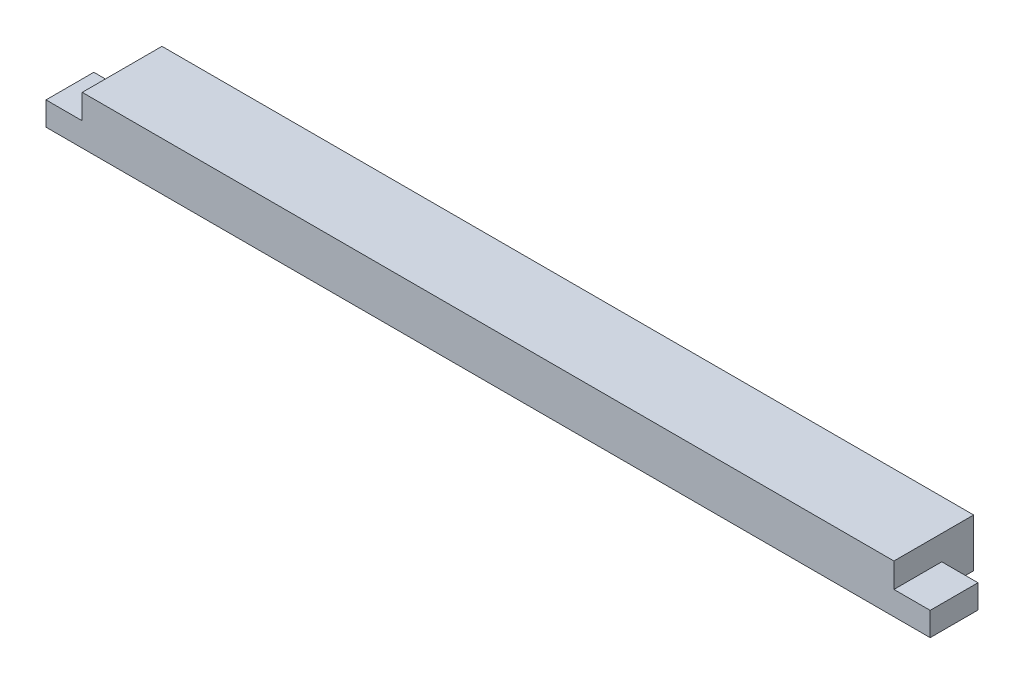
ISO-10303-21;
HEADER;
FILE_DESCRIPTION(('STEP AP214'),'2;1');
FILE_NAME('part.step','',(''),(''),'','','');
FILE_SCHEMA(('AUTOMOTIVE_DESIGN { 1 0 10303 214 1 1 1 1 }'));
ENDSEC;
DATA;
#1=APPLICATION_CONTEXT('core data for automotive mechanical design processes');
#2=APPLICATION_PROTOCOL_DEFINITION('international standard','automotive_design',2000,#1);
#3=PRODUCT_CONTEXT('',#1,'mechanical');
#4=PRODUCT('Part','Part','',(#3));
#5=PRODUCT_RELATED_PRODUCT_CATEGORY('part','',(#4));
#6=PRODUCT_DEFINITION_FORMATION('','',#4);
#7=PRODUCT_DEFINITION_CONTEXT('part definition',#1,'design');
#8=PRODUCT_DEFINITION('design','',#6,#7);
#9=PRODUCT_DEFINITION_SHAPE('','',#8);
#10=(LENGTH_UNIT() NAMED_UNIT(*) SI_UNIT(.MILLI.,.METRE.));
#11=(NAMED_UNIT(*) PLANE_ANGLE_UNIT() SI_UNIT($,.RADIAN.));
#12=(NAMED_UNIT(*) SI_UNIT($,.STERADIAN.) SOLID_ANGLE_UNIT());
#13=UNCERTAINTY_MEASURE_WITH_UNIT(LENGTH_MEASURE(1.E-05),#10,'distance_accuracy_value','');
#14=(GEOMETRIC_REPRESENTATION_CONTEXT(3) GLOBAL_UNCERTAINTY_ASSIGNED_CONTEXT((#13)) GLOBAL_UNIT_ASSIGNED_CONTEXT((#10,
#11,#12)) REPRESENTATION_CONTEXT('',''));
#15=CARTESIAN_POINT('',(0.,0.,0.));
#16=DIRECTION('',(0.,0.,1.));
#17=DIRECTION('',(1.,0.,0.));
#18=AXIS2_PLACEMENT_3D('',#15,#16,#17);
#19=CARTESIAN_POINT('',(-168.,0.,0.));
#20=DIRECTION('',(1.,0.,0.));
#21=DIRECTION('',(0.,1.,0.));
#22=AXIS2_PLACEMENT_3D('',#19,#20,#21);
#23=PLANE('',#22);
#24=DIRECTION('',(0.,-1.,0.));
#25=VECTOR('',#24,1.);
#26=CARTESIAN_POINT('',(-168.,0.,6.2));
#27=LINE('',#26,#25);
#28=CARTESIAN_POINT('',(-168.,-10.1999999999999,6.2));
#29=VERTEX_POINT('',#28);
#30=CARTESIAN_POINT('',(-168.,-20.,6.2));
#31=VERTEX_POINT('',#30);
#32=EDGE_CURVE('E108',#29,#31,#27,.T.);
#33=ORIENTED_EDGE('',*,*,#32,.F.);
#34=DIRECTION('',(0.,0.,-1.));
#35=VECTOR('',#34,1.);
#36=CARTESIAN_POINT('',(-168.,-10.1999999999999,0.));
#37=LINE('',#36,#35);
#38=CARTESIAN_POINT('',(-168.,-10.1999999999999,26.));
#39=VERTEX_POINT('',#38);
#40=EDGE_CURVE('E54',#39,#29,#37,.T.);
#41=ORIENTED_EDGE('',*,*,#40,.F.);
#42=DIRECTION('',(0.,-1.,0.));
#43=VECTOR('',#42,1.);
#44=CARTESIAN_POINT('',(-168.,0.,26.));
#45=LINE('',#44,#43);
#46=CARTESIAN_POINT('',(-168.,0.,26.));
#47=VERTEX_POINT('',#46);
#48=EDGE_CURVE('E170',#47,#39,#45,.T.);
#49=ORIENTED_EDGE('',*,*,#48,.F.);
#50=DIRECTION('',(0.,0.,1.));
#51=VECTOR('',#50,1.);
#52=CARTESIAN_POINT('',(-168.,0.,0.));
#53=LINE('',#52,#51);
#54=CARTESIAN_POINT('',(-168.,0.,-7.));
#55=VERTEX_POINT('',#54);
#56=EDGE_CURVE('E167',#55,#47,#53,.T.);
#57=ORIENTED_EDGE('',*,*,#56,.F.);
#58=DIRECTION('',(0.,1.,0.));
#59=VECTOR('',#58,1.);
#60=CARTESIAN_POINT('',(-168.,0.,-6.99999999999999));
#61=LINE('',#60,#59);
#62=CARTESIAN_POINT('',(-168.,-20.,-6.99999999999999));
#63=VERTEX_POINT('',#62);
#64=EDGE_CURVE('E181',#63,#55,#61,.T.);
#65=ORIENTED_EDGE('',*,*,#64,.F.);
#66=DIRECTION('',(0.,0.,-1.));
#67=VECTOR('',#66,1.);
#68=CARTESIAN_POINT('',(-168.,-20.,26.));
#69=LINE('',#68,#67);
#70=EDGE_CURVE('E11',#31,#63,#69,.T.);
#71=ORIENTED_EDGE('',*,*,#70,.F.);
#72=EDGE_LOOP('',(#33,#41,#49,#57,#65,#71));
#73=FACE_BOUND('',#72,.T.);
#74=ADVANCED_FACE('F35',(#73),#23,.F.);
#75=CARTESIAN_POINT('',(0.,0.,26.));
#76=DIRECTION('',(0.,0.,1.));
#77=DIRECTION('',(1.,0.,0.));
#78=AXIS2_PLACEMENT_3D('',#75,#76,#77);
#79=PLANE('',#78);
#80=DIRECTION('',(0.,-1.,0.));
#81=VECTOR('',#80,1.);
#82=CARTESIAN_POINT('',(168.,0.,26.));
#83=LINE('',#82,#81);
#84=CARTESIAN_POINT('',(168.,0.,26.));
#85=VERTEX_POINT('',#84);
#86=CARTESIAN_POINT('',(168.,-10.1999999999999,26.));
#87=VERTEX_POINT('',#86);
#88=EDGE_CURVE('E157',#85,#87,#83,.T.);
#89=ORIENTED_EDGE('',*,*,#88,.F.);
#90=DIRECTION('',(-1.,0.,0.));
#91=VECTOR('',#90,1.);
#92=CARTESIAN_POINT('',(-168.,0.,26.));
#93=LINE('',#92,#91);
#94=EDGE_CURVE('E184',#85,#47,#93,.T.);
#95=ORIENTED_EDGE('',*,*,#94,.T.);
#96=ORIENTED_EDGE('',*,*,#48,.T.);
#97=DIRECTION('',(-1.,0.,0.));
#98=VECTOR('',#97,1.);
#99=CARTESIAN_POINT('',(-168.,-10.1999999999999,26.));
#100=LINE('',#99,#98);
#101=CARTESIAN_POINT('',(-183.,-10.1999999999999,26.));
#102=VERTEX_POINT('',#101);
#103=EDGE_CURVE('E111',#39,#102,#100,.T.);
#104=ORIENTED_EDGE('',*,*,#103,.T.);
#105=DIRECTION('',(0.,-1.,0.));
#106=VECTOR('',#105,1.);
#107=CARTESIAN_POINT('',(-183.,0.,26.));
#108=LINE('',#107,#106);
#109=CARTESIAN_POINT('',(-183.,-19.9999999999999,26.));
#110=VERTEX_POINT('',#109);
#111=EDGE_CURVE('E132',#102,#110,#108,.T.);
#112=ORIENTED_EDGE('',*,*,#111,.T.);
#113=DIRECTION('',(1.,0.,0.));
#114=VECTOR('',#113,1.);
#115=CARTESIAN_POINT('',(-168.,-20.,26.));
#116=LINE('',#115,#114);
#117=CARTESIAN_POINT('',(183.,-19.9999999999999,26.));
#118=VERTEX_POINT('',#117);
#119=EDGE_CURVE('E186',#110,#118,#116,.T.);
#120=ORIENTED_EDGE('',*,*,#119,.T.);
#121=DIRECTION('',(0.,-1.,0.));
#122=VECTOR('',#121,1.);
#123=CARTESIAN_POINT('',(183.,0.,26.));
#124=LINE('',#123,#122);
#125=CARTESIAN_POINT('',(183.,-10.1999999999999,26.));
#126=VERTEX_POINT('',#125);
#127=EDGE_CURVE('E143',#126,#118,#124,.T.);
#128=ORIENTED_EDGE('',*,*,#127,.F.);
#129=DIRECTION('',(1.,0.,0.));
#130=VECTOR('',#129,1.);
#131=CARTESIAN_POINT('',(168.,-10.1999999999999,26.));
#132=LINE('',#131,#130);
#133=EDGE_CURVE('E155',#87,#126,#132,.T.);
#134=ORIENTED_EDGE('',*,*,#133,.F.);
#135=EDGE_LOOP('',(#89,#95,#96,#104,#112,#120,#128,#134));
#136=FACE_BOUND('',#135,.T.);
#137=ADVANCED_FACE('F204',(#136),#79,.T.);
#138=CARTESIAN_POINT('',(-168.,-20.,26.));
#139=DIRECTION('',(0.,1.,0.));
#140=DIRECTION('',(-1.,0.,0.));
#141=AXIS2_PLACEMENT_3D('',#138,#139,#140);
#142=PLANE('',#141);
#143=ORIENTED_EDGE('',*,*,#119,.F.);
#144=DIRECTION('',(0.,0.,1.));
#145=VECTOR('',#144,1.);
#146=CARTESIAN_POINT('',(-183.,-19.9999999999999,0.));
#147=LINE('',#146,#145);
#148=CARTESIAN_POINT('',(-183.,-19.9999999999999,6.2));
#149=VERTEX_POINT('',#148);
#150=EDGE_CURVE('E129',#149,#110,#147,.T.);
#151=ORIENTED_EDGE('',*,*,#150,.F.);
#152=DIRECTION('',(-1.,0.,0.));
#153=VECTOR('',#152,1.);
#154=CARTESIAN_POINT('',(-168.,-19.9999999999999,6.2));
#155=LINE('',#154,#153);
#156=EDGE_CURVE('E121',#31,#149,#155,.T.);
#157=ORIENTED_EDGE('',*,*,#156,.F.);
#158=ORIENTED_EDGE('',*,*,#70,.T.);
#159=DIRECTION('',(-1.,0.,0.));
#160=VECTOR('',#159,1.);
#161=CARTESIAN_POINT('',(0.,-20.,-6.99999999999999));
#162=LINE('',#161,#160);
#163=CARTESIAN_POINT('',(168.,-20.,-7.));
#164=VERTEX_POINT('',#163);
#165=EDGE_CURVE('E178',#164,#63,#162,.T.);
#166=ORIENTED_EDGE('',*,*,#165,.F.);
#167=DIRECTION('',(0.,0.,-1.));
#168=VECTOR('',#167,1.);
#169=CARTESIAN_POINT('',(168.,-19.9999999999999,26.));
#170=LINE('',#169,#168);
#171=CARTESIAN_POINT('',(168.,-19.9999999999999,6.2));
#172=VERTEX_POINT('',#171);
#173=EDGE_CURVE('E39',#172,#164,#170,.T.);
#174=ORIENTED_EDGE('',*,*,#173,.F.);
#175=DIRECTION('',(1.,0.,0.));
#176=VECTOR('',#175,1.);
#177=CARTESIAN_POINT('',(168.,-19.9999999999999,6.2));
#178=LINE('',#177,#176);
#179=CARTESIAN_POINT('',(183.,-19.9999999999999,6.2));
#180=VERTEX_POINT('',#179);
#181=EDGE_CURVE('E146',#172,#180,#178,.T.);
#182=ORIENTED_EDGE('',*,*,#181,.T.);
#183=DIRECTION('',(0.,0.,1.));
#184=VECTOR('',#183,1.);
#185=CARTESIAN_POINT('',(183.,-19.9999999999999,0.));
#186=LINE('',#185,#184);
#187=EDGE_CURVE('E136',#180,#118,#186,.T.);
#188=ORIENTED_EDGE('',*,*,#187,.T.);
#189=EDGE_LOOP('',(#143,#151,#157,#158,#166,#174,#182,#188));
#190=FACE_BOUND('',#189,.T.);
#191=ADVANCED_FACE('F199',(#190),#142,.F.);
#192=CARTESIAN_POINT('',(168.,0.,26.));
#193=DIRECTION('',(0.,1.,0.));
#194=DIRECTION('',(-1.,0.,0.));
#195=AXIS2_PLACEMENT_3D('',#192,#193,#194);
#196=PLANE('',#195);
#197=DIRECTION('',(0.,0.,1.));
#198=VECTOR('',#197,1.);
#199=CARTESIAN_POINT('',(168.,0.,0.));
#200=LINE('',#199,#198);
#201=CARTESIAN_POINT('',(168.,0.,-6.99999999999999));
#202=VERTEX_POINT('',#201);
#203=EDGE_CURVE('E165',#202,#85,#200,.T.);
#204=ORIENTED_EDGE('',*,*,#203,.F.);
#205=DIRECTION('',(1.,0.,0.));
#206=VECTOR('',#205,1.);
#207=CARTESIAN_POINT('',(0.,0.,-6.99999999999999));
#208=LINE('',#207,#206);
#209=EDGE_CURVE('E172',#55,#202,#208,.T.);
#210=ORIENTED_EDGE('',*,*,#209,.F.);
#211=ORIENTED_EDGE('',*,*,#56,.T.);
#212=ORIENTED_EDGE('',*,*,#94,.F.);
#213=EDGE_LOOP('',(#204,#210,#211,#212));
#214=FACE_BOUND('',#213,.T.);
#215=ADVANCED_FACE('F37',(#214),#196,.T.);
#216=CARTESIAN_POINT('',(0.,0.,-6.99999999999999));
#217=DIRECTION('',(0.,0.,-1.));
#218=DIRECTION('',(-1.,0.,0.));
#219=AXIS2_PLACEMENT_3D('',#216,#217,#218);
#220=PLANE('',#219);
#221=ORIENTED_EDGE('',*,*,#209,.T.);
#222=DIRECTION('',(0.,-1.,0.));
#223=VECTOR('',#222,1.);
#224=CARTESIAN_POINT('',(168.,0.,-6.99999999999999));
#225=LINE('',#224,#223);
#226=EDGE_CURVE('E175',#202,#164,#225,.T.);
#227=ORIENTED_EDGE('',*,*,#226,.T.);
#228=ORIENTED_EDGE('',*,*,#165,.T.);
#229=ORIENTED_EDGE('',*,*,#64,.T.);
#230=EDGE_LOOP('',(#221,#227,#228,#229));
#231=FACE_BOUND('',#230,.T.);
#232=ADVANCED_FACE('F197',(#231),#220,.T.);
#233=CARTESIAN_POINT('',(168.,0.,0.));
#234=DIRECTION('',(-1.,0.,0.));
#235=DIRECTION('',(0.,1.,0.));
#236=AXIS2_PLACEMENT_3D('',#233,#234,#235);
#237=PLANE('',#236);
#238=ORIENTED_EDGE('',*,*,#88,.T.);
#239=DIRECTION('',(0.,0.,-1.));
#240=VECTOR('',#239,1.);
#241=CARTESIAN_POINT('',(168.,-10.1999999999999,0.));
#242=LINE('',#241,#240);
#243=CARTESIAN_POINT('',(168.,-10.1999999999999,6.2));
#244=VERTEX_POINT('',#243);
#245=EDGE_CURVE('E142',#87,#244,#242,.T.);
#246=ORIENTED_EDGE('',*,*,#245,.T.);
#247=DIRECTION('',(0.,-1.,0.));
#248=VECTOR('',#247,1.);
#249=CARTESIAN_POINT('',(168.,0.,6.2));
#250=LINE('',#249,#248);
#251=EDGE_CURVE('E139',#244,#172,#250,.T.);
#252=ORIENTED_EDGE('',*,*,#251,.T.);
#253=ORIENTED_EDGE('',*,*,#173,.T.);
#254=ORIENTED_EDGE('',*,*,#226,.F.);
#255=ORIENTED_EDGE('',*,*,#203,.T.);
#256=EDGE_LOOP('',(#238,#246,#252,#253,#254,#255));
#257=FACE_BOUND('',#256,.T.);
#258=ADVANCED_FACE('F191',(#257),#237,.F.);
#259=CARTESIAN_POINT('',(168.,-10.1999999999999,0.));
#260=DIRECTION('',(0.,-1.,0.));
#261=DIRECTION('',(1.,0.,0.));
#262=AXIS2_PLACEMENT_3D('',#259,#260,#261);
#263=PLANE('',#262);
#264=DIRECTION('',(0.,0.,-1.));
#265=VECTOR('',#264,1.);
#266=CARTESIAN_POINT('',(183.,-10.1999999999999,0.));
#267=LINE('',#266,#265);
#268=CARTESIAN_POINT('',(183.,-10.1999999999999,6.2));
#269=VERTEX_POINT('',#268);
#270=EDGE_CURVE('E151',#126,#269,#267,.T.);
#271=ORIENTED_EDGE('',*,*,#270,.T.);
#272=DIRECTION('',(1.,0.,0.));
#273=VECTOR('',#272,1.);
#274=CARTESIAN_POINT('',(168.,-10.1999999999999,6.2));
#275=LINE('',#274,#273);
#276=EDGE_CURVE('E158',#244,#269,#275,.T.);
#277=ORIENTED_EDGE('',*,*,#276,.F.);
#278=ORIENTED_EDGE('',*,*,#245,.F.);
#279=ORIENTED_EDGE('',*,*,#133,.T.);
#280=EDGE_LOOP('',(#271,#277,#278,#279));
#281=FACE_BOUND('',#280,.T.);
#282=ADVANCED_FACE('F208',(#281),#263,.F.);
#283=CARTESIAN_POINT('',(168.,0.,6.2));
#284=DIRECTION('',(0.,0.,1.));
#285=DIRECTION('',(0.,-1.,0.));
#286=AXIS2_PLACEMENT_3D('',#283,#284,#285);
#287=PLANE('',#286);
#288=DIRECTION('',(0.,-1.,0.));
#289=VECTOR('',#288,1.);
#290=CARTESIAN_POINT('',(183.,0.,6.2));
#291=LINE('',#290,#289);
#292=EDGE_CURVE('E149',#269,#180,#291,.T.);
#293=ORIENTED_EDGE('',*,*,#292,.T.);
#294=ORIENTED_EDGE('',*,*,#181,.F.);
#295=ORIENTED_EDGE('',*,*,#251,.F.);
#296=ORIENTED_EDGE('',*,*,#276,.T.);
#297=EDGE_LOOP('',(#293,#294,#295,#296));
#298=FACE_BOUND('',#297,.T.);
#299=ADVANCED_FACE('F211',(#298),#287,.F.);
#300=CARTESIAN_POINT('',(183.,0.,0.));
#301=DIRECTION('',(1.,0.,0.));
#302=DIRECTION('',(0.,1.,0.));
#303=AXIS2_PLACEMENT_3D('',#300,#301,#302);
#304=PLANE('',#303);
#305=ORIENTED_EDGE('',*,*,#187,.F.);
#306=ORIENTED_EDGE('',*,*,#292,.F.);
#307=ORIENTED_EDGE('',*,*,#270,.F.);
#308=ORIENTED_EDGE('',*,*,#127,.T.);
#309=EDGE_LOOP('',(#305,#306,#307,#308));
#310=FACE_BOUND('',#309,.T.);
#311=ADVANCED_FACE('F214',(#310),#304,.T.);
#312=CARTESIAN_POINT('',(-168.,0.,6.2));
#313=DIRECTION('',(0.,0.,-1.));
#314=DIRECTION('',(0.,1.,0.));
#315=AXIS2_PLACEMENT_3D('',#312,#313,#314);
#316=PLANE('',#315);
#317=DIRECTION('',(0.,-1.,0.));
#318=VECTOR('',#317,1.);
#319=CARTESIAN_POINT('',(-183.,0.,6.2));
#320=LINE('',#319,#318);
#321=CARTESIAN_POINT('',(-183.,-10.1999999999999,6.2));
#322=VERTEX_POINT('',#321);
#323=EDGE_CURVE('E117',#322,#149,#320,.T.);
#324=ORIENTED_EDGE('',*,*,#323,.F.);
#325=DIRECTION('',(-1.,0.,0.));
#326=VECTOR('',#325,1.);
#327=CARTESIAN_POINT('',(-168.,-10.1999999999999,6.2));
#328=LINE('',#327,#326);
#329=EDGE_CURVE('E114',#29,#322,#328,.T.);
#330=ORIENTED_EDGE('',*,*,#329,.F.);
#331=ORIENTED_EDGE('',*,*,#32,.T.);
#332=ORIENTED_EDGE('',*,*,#156,.T.);
#333=EDGE_LOOP('',(#324,#330,#331,#332));
#334=FACE_BOUND('',#333,.T.);
#335=ADVANCED_FACE('F115',(#334),#316,.T.);
#336=CARTESIAN_POINT('',(-168.,-10.1999999999999,0.));
#337=DIRECTION('',(0.,1.,0.));
#338=DIRECTION('',(-1.,0.,0.));
#339=AXIS2_PLACEMENT_3D('',#336,#337,#338);
#340=PLANE('',#339);
#341=DIRECTION('',(0.,0.,-1.));
#342=VECTOR('',#341,1.);
#343=CARTESIAN_POINT('',(-183.,-10.1999999999999,0.));
#344=LINE('',#343,#342);
#345=EDGE_CURVE('E126',#102,#322,#344,.T.);
#346=ORIENTED_EDGE('',*,*,#345,.F.);
#347=ORIENTED_EDGE('',*,*,#103,.F.);
#348=ORIENTED_EDGE('',*,*,#40,.T.);
#349=ORIENTED_EDGE('',*,*,#329,.T.);
#350=EDGE_LOOP('',(#346,#347,#348,#349));
#351=FACE_BOUND('',#350,.T.);
#352=ADVANCED_FACE('F124',(#351),#340,.T.);
#353=CARTESIAN_POINT('',(-183.,0.,0.));
#354=DIRECTION('',(-1.,0.,0.));
#355=DIRECTION('',(0.,1.,0.));
#356=AXIS2_PLACEMENT_3D('',#353,#354,#355);
#357=PLANE('',#356);
#358=ORIENTED_EDGE('',*,*,#150,.T.);
#359=ORIENTED_EDGE('',*,*,#111,.F.);
#360=ORIENTED_EDGE('',*,*,#345,.T.);
#361=ORIENTED_EDGE('',*,*,#323,.T.);
#362=EDGE_LOOP('',(#358,#359,#360,#361));
#363=FACE_BOUND('',#362,.T.);
#364=ADVANCED_FACE('F302',(#363),#357,.T.);
#365=CLOSED_SHELL('',(#74,#137,#191,#215,#232,#258,#282,#299,#311,#335,#352,#364));
#366=MANIFOLD_SOLID_BREP('B2',#365);
#367=ADVANCED_BREP_SHAPE_REPRESENTATION('',(#18,#366),#14);
#368=SHAPE_DEFINITION_REPRESENTATION(#9,#367);
ENDSEC;
END-ISO-10303-21;
